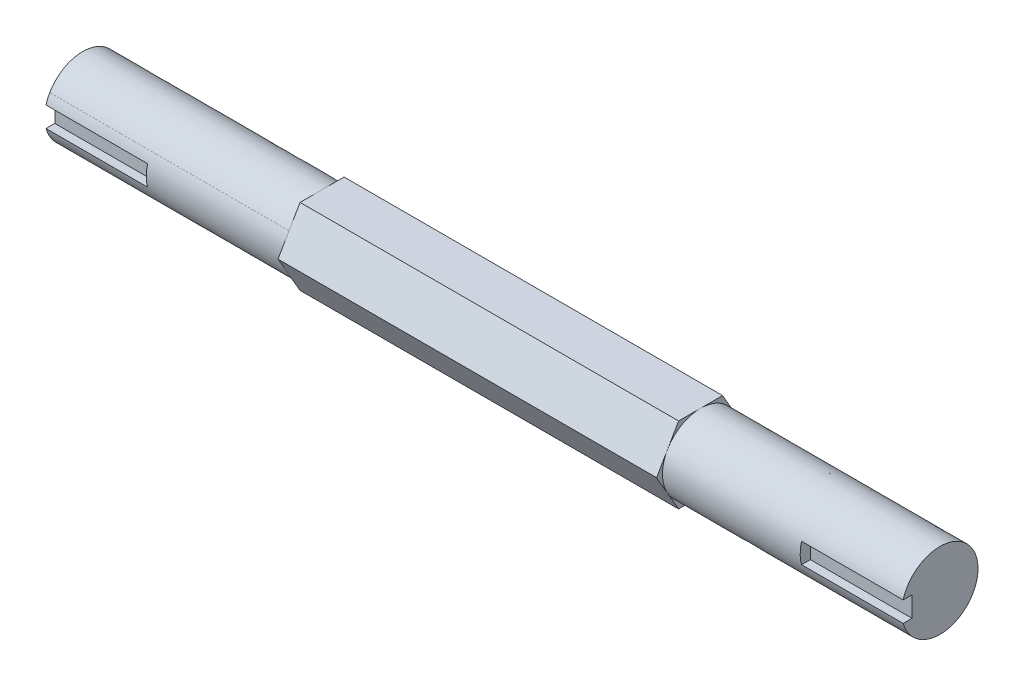
ISO-10303-21;
HEADER;
FILE_DESCRIPTION(('STEP AP214'),'2;1');
FILE_NAME('part.step','',(''),(''),'','','');
FILE_SCHEMA(('AUTOMOTIVE_DESIGN { 1 0 10303 214 1 1 1 1 }'));
ENDSEC;
DATA;
#1=APPLICATION_CONTEXT('core data for automotive mechanical design processes');
#2=APPLICATION_PROTOCOL_DEFINITION('international standard','automotive_design',2000,#1);
#3=PRODUCT_CONTEXT('',#1,'mechanical');
#4=PRODUCT('Part','Part','',(#3));
#5=PRODUCT_RELATED_PRODUCT_CATEGORY('part','',(#4));
#6=PRODUCT_DEFINITION_FORMATION('','',#4);
#7=PRODUCT_DEFINITION_CONTEXT('part definition',#1,'design');
#8=PRODUCT_DEFINITION('design','',#6,#7);
#9=PRODUCT_DEFINITION_SHAPE('','',#8);
#10=(LENGTH_UNIT() NAMED_UNIT(*) SI_UNIT(.MILLI.,.METRE.));
#11=(NAMED_UNIT(*) PLANE_ANGLE_UNIT() SI_UNIT($,.RADIAN.));
#12=(NAMED_UNIT(*) SI_UNIT($,.STERADIAN.) SOLID_ANGLE_UNIT());
#13=UNCERTAINTY_MEASURE_WITH_UNIT(LENGTH_MEASURE(1.E-05),#10,'distance_accuracy_value','');
#14=(GEOMETRIC_REPRESENTATION_CONTEXT(3) GLOBAL_UNCERTAINTY_ASSIGNED_CONTEXT((#13)) GLOBAL_UNIT_ASSIGNED_CONTEXT((#10,
#11,#12)) REPRESENTATION_CONTEXT('',''));
#15=CARTESIAN_POINT('',(0.,0.,0.));
#16=DIRECTION('',(0.,0.,1.));
#17=DIRECTION('',(1.,0.,0.));
#18=AXIS2_PLACEMENT_3D('',#15,#16,#17);
#19=CARTESIAN_POINT('',(-310.500108412167,140.898907372962,178.485208614066));
#20=CARTESIAN_POINT('',(-310.500108412167,140.898907372962,141.51479138593));
#21=CARTESIAN_POINT('',(-310.50010841216,108.878907372962,178.485208614066));
#22=CARTESIAN_POINT('',(-310.50010841216,108.878907372962,141.51479138593));
#23=(BOUNDED_SURFACE() B_SPLINE_SURFACE(1,1,((#19,#20),(#21,#22)),.UNSPECIFIED.,.F.,.F.,
.F.) B_SPLINE_SURFACE_WITH_KNOTS((2,2),(2,2),(-1.601,1.601),(-1.84852086140681,
1.84852086140681),.UNSPECIFIED.) GEOMETRIC_REPRESENTATION_ITEM() RATIONAL_B_SPLINE_SURFACE(((1.,
1.),(1.,1.))) REPRESENTATION_ITEM('') SURFACE());
#24=DIRECTION('',(0.,0.,1.));
#25=VECTOR('',#24,1.);
#26=CARTESIAN_POINT('',(-310.500108412167,139.8888999224,151.339736276399));
#27=LINE('',#26,#25);
#28=CARTESIAN_POINT('',(-310.500108412167,139.8888999224,159.999990314243));
#29=VERTEX_POINT('',#28);
#30=CARTESIAN_POINT('',(-310.500108412167,139.8888999224,168.660244352088));
#31=VERTEX_POINT('',#30);
#32=EDGE_CURVE('E205',#29,#31,#27,.T.);
#33=DIRECTION('',(0.,-0.866025403784439,0.499999999999999));
#34=VECTOR('',#33,1.);
#35=CARTESIAN_POINT('',(-310.500108412167,139.8888999224,168.660244352088));
#36=LINE('',#35,#34);
#37=CARTESIAN_POINT('',(-310.500108412167,132.388899922386,172.990371371018));
#38=VERTEX_POINT('',#37);
#39=EDGE_CURVE('E223',#31,#38,#36,.T.);
#40=CARTESIAN_POINT('',(-310.500108412167,139.888899922381,159.999990314243));
#41=CARTESIAN_POINT('',(-310.500108412166,139.888899922381,144.999990314242));
#42=CARTESIAN_POINT('',(-310.500108412164,124.888899922381,144.999990314243));
#43=CARTESIAN_POINT('',(-310.50010841216,109.888899922381,144.999990314242));
#44=CARTESIAN_POINT('',(-310.50010841216,109.888899922381,159.999990314243));
#45=CARTESIAN_POINT('',(-310.500108412161,109.888899922381,174.999990314243));
#46=CARTESIAN_POINT('',(-310.500108412164,124.888899922381,174.999990314243));
#47=CARTESIAN_POINT('',(-310.500108412167,139.888899922381,174.999990314243));
#48=CARTESIAN_POINT('',(-310.500108412167,139.888899922381,159.999990314243));
#49=(BOUNDED_CURVE() B_SPLINE_CURVE(2,(#40,#41,#42,#43,#44,#45,#46,#47,#48),.UNSPECIFIED.,.T.,
.F.) B_SPLINE_CURVE_WITH_KNOTS((3,2,2,2,3),(-3.14159265358979,-1.5707963267949,0.,
1.5707963267949,3.14159265358979),
.UNSPECIFIED.) CURVE() GEOMETRIC_REPRESENTATION_ITEM() RATIONAL_B_SPLINE_CURVE((1.,
0.707106781186539,1.,0.707106781186539,1.,0.707106781186553,1.,0.707106781186553,1.)) REPRESENTATION_ITEM(''));
#50=EDGE_CURVE('E307',#38,#29,#49,.T.);
#51=ORIENTED_EDGE('',*,*,#32,.T.);
#52=ORIENTED_EDGE('',*,*,#39,.T.);
#53=ORIENTED_EDGE('',*,*,#50,.T.);
#54=EDGE_LOOP('',(#51,#52,#53));
#55=FACE_BOUND('',#54,.T.);
#56=ADVANCED_FACE('F39',(#55),#23,.T.);
#57=CARTESIAN_POINT('',(-310.500108412167,117.388899922386,172.990371371002));
#58=VERTEX_POINT('',#57);
#59=EDGE_CURVE('E289',#58,#38,#49,.T.);
#60=CARTESIAN_POINT('',(-310.500108412167,124.8888999224,177.320498389932));
#61=VERTEX_POINT('',#60);
#62=EDGE_CURVE('E209',#38,#61,#36,.T.);
#63=DIRECTION('',(0.,-0.866025403784439,-0.499999999999999));
#64=VECTOR('',#63,1.);
#65=CARTESIAN_POINT('',(-310.500108412167,124.8888999224,177.320498389932));
#66=LINE('',#65,#64);
#67=EDGE_CURVE('E631',#61,#58,#66,.T.);
#68=ORIENTED_EDGE('',*,*,#59,.T.);
#69=ORIENTED_EDGE('',*,*,#62,.T.);
#70=ORIENTED_EDGE('',*,*,#67,.T.);
#71=EDGE_LOOP('',(#68,#69,#70));
#72=FACE_BOUND('',#71,.T.);
#73=ADVANCED_FACE('F578',(#72),#23,.T.);
#74=CARTESIAN_POINT('',(-310.500108412167,109.8888999224,159.999990314243));
#75=VERTEX_POINT('',#74);
#76=EDGE_CURVE('E612',#75,#58,#49,.T.);
#77=CARTESIAN_POINT('',(-310.500108412167,109.8888999224,168.660244352088));
#78=VERTEX_POINT('',#77);
#79=EDGE_CURVE('E792',#58,#78,#66,.T.);
#80=DIRECTION('',(0.,0.,-1.));
#81=VECTOR('',#80,1.);
#82=CARTESIAN_POINT('',(-310.500108412167,109.8888999224,168.660244352088));
#83=LINE('',#82,#81);
#84=EDGE_CURVE('E217',#78,#75,#83,.T.);
#85=ORIENTED_EDGE('',*,*,#76,.T.);
#86=ORIENTED_EDGE('',*,*,#79,.T.);
#87=ORIENTED_EDGE('',*,*,#84,.T.);
#88=EDGE_LOOP('',(#85,#86,#87));
#89=FACE_BOUND('',#88,.T.);
#90=ADVANCED_FACE('F585',(#89),#23,.T.);
#91=DIRECTION('',(0.,0.866025403784439,0.499999999999999));
#92=VECTOR('',#91,1.);
#93=CARTESIAN_POINT('',(-310.500108412167,124.8888999224,142.679482238555));
#94=LINE('',#93,#92);
#95=CARTESIAN_POINT('',(-310.500108412167,132.388899922386,147.009609257469));
#96=VERTEX_POINT('',#95);
#97=CARTESIAN_POINT('',(-310.500108412167,139.8888999224,151.339736276399));
#98=VERTEX_POINT('',#97);
#99=EDGE_CURVE('E193',#96,#98,#94,.T.);
#100=EDGE_CURVE('E202',#98,#29,#27,.T.);
#101=EDGE_CURVE('E213',#29,#96,#49,.T.);
#102=ORIENTED_EDGE('',*,*,#99,.T.);
#103=ORIENTED_EDGE('',*,*,#100,.T.);
#104=ORIENTED_EDGE('',*,*,#101,.T.);
#105=EDGE_LOOP('',(#102,#103,#104));
#106=FACE_BOUND('',#105,.T.);
#107=ADVANCED_FACE('F211',(#106),#23,.T.);
#108=CARTESIAN_POINT('',(-310.500108412167,117.388899922386,147.009609257485));
#109=VERTEX_POINT('',#108);
#110=EDGE_CURVE('E606',#109,#75,#49,.T.);
#111=CARTESIAN_POINT('',(-310.500108412167,109.8888999224,151.339736276399));
#112=VERTEX_POINT('',#111);
#113=EDGE_CURVE('E607',#75,#112,#83,.T.);
#114=DIRECTION('',(0.,0.866025403784439,-0.5));
#115=VECTOR('',#114,1.);
#116=CARTESIAN_POINT('',(-310.500108412167,109.8888999224,151.339736276399));
#117=LINE('',#116,#115);
#118=EDGE_CURVE('E214',#112,#109,#117,.T.);
#119=ORIENTED_EDGE('',*,*,#110,.T.);
#120=ORIENTED_EDGE('',*,*,#113,.T.);
#121=ORIENTED_EDGE('',*,*,#118,.T.);
#122=EDGE_LOOP('',(#119,#120,#121));
#123=FACE_BOUND('',#122,.T.);
#124=ADVANCED_FACE('F592',(#123),#23,.T.);
#125=DIRECTION('',(-1.74159643676213E-13,0.866025403784439,-0.5));
#126=VECTOR('',#125,1.);
#127=CARTESIAN_POINT('',(-310.500108412162,117.388901316267,147.009608452727));
#128=LINE('',#127,#126);
#129=CARTESIAN_POINT('',(-310.500108412163,124.8888999224,142.679482238555));
#130=VERTEX_POINT('',#129);
#131=EDGE_CURVE('E12',#109,#130,#128,.T.);
#132=EDGE_CURVE('E60',#130,#96,#94,.T.);
#133=EDGE_CURVE('E313',#96,#109,#49,.T.);
#134=ORIENTED_EDGE('',*,*,#131,.T.);
#135=ORIENTED_EDGE('',*,*,#132,.T.);
#136=ORIENTED_EDGE('',*,*,#133,.T.);
#137=EDGE_LOOP('',(#134,#135,#136));
#138=FACE_BOUND('',#137,.T.);
#139=ADVANCED_FACE('F581',(#138),#23,.T.);
#140=CARTESIAN_POINT('',(-216.290108412163,120.8888999224,174.466822609044));
#141=CARTESIAN_POINT('',(-256.310108412163,120.888899922392,174.466822609044));
#142=CARTESIAN_POINT('',(-216.290108412163,120.8888999224,170.989990314243));
#143=CARTESIAN_POINT('',(-256.310108412163,120.888899922392,170.989990314243));
#144=(BOUNDED_SURFACE() B_SPLINE_SURFACE(1,1,((#140,#141),(#142,#143)),.UNSPECIFIED.,.F.,.F.,
.F.) B_SPLINE_SURFACE_WITH_KNOTS((2,2),(2,2),(-0.001,0.346683229480102),(-0.00100000000000711,
4.001),.UNSPECIFIED.) GEOMETRIC_REPRESENTATION_ITEM() RATIONAL_B_SPLINE_SURFACE(((1.,1.),(1.,1.))) REPRESENTATION_ITEM('') SURFACE());
#145=CARTESIAN_POINT('',(-216.300108412163,120.8888999224,170.999990314243));
#146=CARTESIAN_POINT('',(-216.300108412163,120.8888999224,174.456822609044));
#147=(BOUNDED_CURVE() B_SPLINE_CURVE(1,(#145,#146),.UNSPECIFIED.,.F.,
.F.) B_SPLINE_CURVE_WITH_KNOTS((2,2),(0.55,0.895683229480099),
.UNSPECIFIED.) CURVE() GEOMETRIC_REPRESENTATION_ITEM() RATIONAL_B_SPLINE_CURVE((1.,1.)) REPRESENTATION_ITEM(''));
#148=CARTESIAN_POINT('',(-216.300108412163,120.8888999224,170.999990314243));
#149=VERTEX_POINT('',#148);
#150=CARTESIAN_POINT('',(-216.300108412163,120.8888999224,174.456822609044));
#151=VERTEX_POINT('',#150);
#152=EDGE_CURVE('E317',#149,#151,#147,.T.);
#153=CARTESIAN_POINT('',(-216.300108412163,120.8888999224,170.999990314243));
#154=CARTESIAN_POINT('',(-256.300108412163,120.888899922392,170.999990314243));
#155=(BOUNDED_CURVE() B_SPLINE_CURVE(1,(#153,#154),.UNSPECIFIED.,.F.,
.F.) B_SPLINE_CURVE_WITH_KNOTS((2,2),(0.,4.),
.UNSPECIFIED.) CURVE() GEOMETRIC_REPRESENTATION_ITEM() RATIONAL_B_SPLINE_CURVE((1.,1.)) REPRESENTATION_ITEM(''));
#156=CARTESIAN_POINT('',(-256.300108412163,120.888899922392,170.999990314243));
#157=VERTEX_POINT('',#156);
#158=EDGE_CURVE('E361',#149,#157,#155,.T.);
#159=CARTESIAN_POINT('',(-256.300108412163,120.888899922392,170.999990314243));
#160=CARTESIAN_POINT('',(-256.300108412163,120.888899922392,174.456822609044));
#161=(BOUNDED_CURVE() B_SPLINE_CURVE(1,(#159,#160),.UNSPECIFIED.,.F.,
.F.) B_SPLINE_CURVE_WITH_KNOTS((2,2),(1.1,1.4456832294801),
.UNSPECIFIED.) CURVE() GEOMETRIC_REPRESENTATION_ITEM() RATIONAL_B_SPLINE_CURVE((1.,1.)) REPRESENTATION_ITEM(''));
#162=CARTESIAN_POINT('',(-256.300108412163,120.888899922392,174.456822609044));
#163=VERTEX_POINT('',#162);
#164=EDGE_CURVE('E353',#157,#163,#161,.T.);
#165=CARTESIAN_POINT('',(-216.300108412163,120.8888999224,174.456822609044));
#166=CARTESIAN_POINT('',(-256.300108412163,120.888899922392,174.456822609044));
#167=(BOUNDED_CURVE() B_SPLINE_CURVE(1,(#165,#166),.UNSPECIFIED.,.F.,
.F.) B_SPLINE_CURVE_WITH_KNOTS((2,2),(-9.42,-5.42),
.UNSPECIFIED.) CURVE() GEOMETRIC_REPRESENTATION_ITEM() RATIONAL_B_SPLINE_CURVE((1.,1.)) REPRESENTATION_ITEM(''));
#168=EDGE_CURVE('E507',#151,#163,#167,.T.);
#169=ORIENTED_EDGE('',*,*,#152,.F.);
#170=ORIENTED_EDGE('',*,*,#158,.T.);
#171=ORIENTED_EDGE('',*,*,#164,.T.);
#172=ORIENTED_EDGE('',*,*,#168,.F.);
#173=EDGE_LOOP('',(#169,#170,#171,#172));
#174=FACE_BOUND('',#173,.T.);
#175=ADVANCED_FACE('F496',(#174),#144,.T.);
#176=CARTESIAN_POINT('',(-216.290108412163,120.8788999224,170.999990314243));
#177=CARTESIAN_POINT('',(-256.310108412163,120.878899922392,170.999990314243));
#178=CARTESIAN_POINT('',(-216.290108412164,128.8988999224,170.999990314243));
#179=CARTESIAN_POINT('',(-256.310108412164,128.898899922392,170.999990314243));
#180=(BOUNDED_SURFACE() B_SPLINE_SURFACE(1,1,((#176,#177),(#178,#179)),.UNSPECIFIED.,.F.,.F.,
.F.) B_SPLINE_SURFACE_WITH_KNOTS((2,2),(2,2),(-0.001,0.801),(-0.00100000000000711,4.001),
.UNSPECIFIED.) GEOMETRIC_REPRESENTATION_ITEM() RATIONAL_B_SPLINE_SURFACE(((1.,1.),(1.,1.))) REPRESENTATION_ITEM('') SURFACE());
#181=CARTESIAN_POINT('',(-216.300108412164,128.8888999224,170.999990314243));
#182=CARTESIAN_POINT('',(-216.300108412163,120.8888999224,170.999990314243));
#183=(BOUNDED_CURVE() B_SPLINE_CURVE(1,(#181,#182),.UNSPECIFIED.,.F.,
.F.) B_SPLINE_CURVE_WITH_KNOTS((2,2),(-0.200000000000003,0.6),
.UNSPECIFIED.) CURVE() GEOMETRIC_REPRESENTATION_ITEM() RATIONAL_B_SPLINE_CURVE((1.,1.)) REPRESENTATION_ITEM(''));
#184=CARTESIAN_POINT('',(-216.300108412164,128.8888999224,170.999990314243));
#185=VERTEX_POINT('',#184);
#186=EDGE_CURVE('E306',#185,#149,#183,.T.);
#187=CARTESIAN_POINT('',(-216.300108412164,128.8888999224,170.999990314243));
#188=CARTESIAN_POINT('',(-256.300108412164,128.888899922392,170.999990314243));
#189=(BOUNDED_CURVE() B_SPLINE_CURVE(1,(#187,#188),.UNSPECIFIED.,.F.,
.F.) B_SPLINE_CURVE_WITH_KNOTS((2,2),(0.,4.),
.UNSPECIFIED.) CURVE() GEOMETRIC_REPRESENTATION_ITEM() RATIONAL_B_SPLINE_CURVE((1.,1.)) REPRESENTATION_ITEM(''));
#190=CARTESIAN_POINT('',(-256.300108412164,128.888899922392,170.999990314243));
#191=VERTEX_POINT('',#190);
#192=EDGE_CURVE('E362',#185,#191,#189,.T.);
#193=CARTESIAN_POINT('',(-256.300108412164,128.888899922392,170.999990314243));
#194=CARTESIAN_POINT('',(-256.300108412163,120.888899922393,170.999990314243));
#195=(BOUNDED_CURVE() B_SPLINE_CURVE(1,(#193,#194),.UNSPECIFIED.,.F.,
.F.) B_SPLINE_CURVE_WITH_KNOTS((2,2),(0.,0.8),
.UNSPECIFIED.) CURVE() GEOMETRIC_REPRESENTATION_ITEM() RATIONAL_B_SPLINE_CURVE((1.,1.)) REPRESENTATION_ITEM(''));
#196=EDGE_CURVE('E435',#191,#157,#195,.T.);
#197=ORIENTED_EDGE('',*,*,#186,.F.);
#198=ORIENTED_EDGE('',*,*,#192,.T.);
#199=ORIENTED_EDGE('',*,*,#196,.T.);
#200=ORIENTED_EDGE('',*,*,#158,.F.);
#201=EDGE_LOOP('',(#197,#198,#199,#200));
#202=FACE_BOUND('',#201,.T.);
#203=ADVANCED_FACE('F499',(#202),#180,.T.);
#204=CARTESIAN_POINT('',(-216.290108412164,128.8888999224,170.989990314243));
#205=CARTESIAN_POINT('',(-256.310108412164,128.888899922392,170.989990314243));
#206=CARTESIAN_POINT('',(-216.290108412164,128.8888999224,174.466822609044));
#207=CARTESIAN_POINT('',(-256.310108412164,128.888899922392,174.466822609044));
#208=(BOUNDED_SURFACE() B_SPLINE_SURFACE(1,1,((#204,#205),(#206,#207)),.UNSPECIFIED.,.F.,.F.,
.F.) B_SPLINE_SURFACE_WITH_KNOTS((2,2),(2,2),(-0.001,0.346683229480102),(-0.00100000000000711,
4.001),.UNSPECIFIED.) GEOMETRIC_REPRESENTATION_ITEM() RATIONAL_B_SPLINE_SURFACE(((1.,1.),(1.,1.))) REPRESENTATION_ITEM('') SURFACE());
#209=CARTESIAN_POINT('',(-216.300108412164,128.8888999224,174.456822609044));
#210=CARTESIAN_POINT('',(-216.300108412164,128.8888999224,170.999990314243));
#211=(BOUNDED_CURVE() B_SPLINE_CURVE(1,(#209,#210),.UNSPECIFIED.,.F.,
.F.) B_SPLINE_CURVE_WITH_KNOTS((2,2),(-0.722841614740048,-0.377158385259946),
.UNSPECIFIED.) CURVE() GEOMETRIC_REPRESENTATION_ITEM() RATIONAL_B_SPLINE_CURVE((1.,1.)) REPRESENTATION_ITEM(''));
#212=CARTESIAN_POINT('',(-216.300108412164,128.8888999224,174.456822609044));
#213=VERTEX_POINT('',#212);
#214=EDGE_CURVE('E434',#213,#185,#211,.T.);
#215=CARTESIAN_POINT('',(-256.300108412164,128.888899922392,174.456822609044));
#216=CARTESIAN_POINT('',(-216.300108412164,128.8888999224,174.456822609044));
#217=(BOUNDED_CURVE() B_SPLINE_CURVE(1,(#215,#216),.UNSPECIFIED.,.F.,
.F.) B_SPLINE_CURVE_WITH_KNOTS((2,2),(5.42,9.42),
.UNSPECIFIED.) CURVE() GEOMETRIC_REPRESENTATION_ITEM() RATIONAL_B_SPLINE_CURVE((1.,1.)) REPRESENTATION_ITEM(''));
#218=CARTESIAN_POINT('',(-256.300108412164,128.888899922392,174.456822609044));
#219=VERTEX_POINT('',#218);
#220=EDGE_CURVE('E294',#219,#213,#217,.T.);
#221=CARTESIAN_POINT('',(-256.300108412164,128.888899922392,174.456822609044));
#222=CARTESIAN_POINT('',(-256.300108412164,128.888899922392,170.999990314243));
#223=(BOUNDED_CURVE() B_SPLINE_CURVE(1,(#221,#222),.UNSPECIFIED.,.F.,
.F.) B_SPLINE_CURVE_WITH_KNOTS((2,2),(-1.4456832294801,-1.1),
.UNSPECIFIED.) CURVE() GEOMETRIC_REPRESENTATION_ITEM() RATIONAL_B_SPLINE_CURVE((1.,1.)) REPRESENTATION_ITEM(''));
#224=EDGE_CURVE('E443',#219,#191,#223,.T.);
#225=ORIENTED_EDGE('',*,*,#214,.F.);
#226=ORIENTED_EDGE('',*,*,#220,.F.);
#227=ORIENTED_EDGE('',*,*,#224,.T.);
#228=ORIENTED_EDGE('',*,*,#192,.F.);
#229=EDGE_LOOP('',(#225,#226,#227,#228));
#230=FACE_BOUND('',#229,.T.);
#231=ADVANCED_FACE('F637',(#230),#208,.T.);
#232=CARTESIAN_POINT('',(-256.300108412163,120.878899922392,170.989990314243));
#233=CARTESIAN_POINT('',(-256.300108412163,120.878899922392,175.57356575123));
#234=CARTESIAN_POINT('',(-256.300108412164,128.898899922392,170.989990314243));
#235=CARTESIAN_POINT('',(-256.300108412164,128.898899922392,175.57356575123));
#236=(BOUNDED_SURFACE() B_SPLINE_SURFACE(1,1,((#232,#233),(#234,#235)),.UNSPECIFIED.,.F.,.F.,
.F.) B_SPLINE_SURFACE_WITH_KNOTS((2,2),(2,2),(-0.401,0.401000000000006),(-0.201000000000003,
0.25735754369867),.UNSPECIFIED.) GEOMETRIC_REPRESENTATION_ITEM() RATIONAL_B_SPLINE_SURFACE(((1.,
1.),(1.,1.))) REPRESENTATION_ITEM('') SURFACE());
#237=CARTESIAN_POINT('',(-256.300108412163,120.888899922392,174.456822609044));
#238=CARTESIAN_POINT('',(-256.300108412164,124.888899922392,175.56356575123));
#239=CARTESIAN_POINT('',(-256.300108412164,128.888899922392,174.456822609044));
#240=(BOUNDED_CURVE() B_SPLINE_CURVE(2,(#237,#238,#239),.UNSPECIFIED.,.F.,
.F.) B_SPLINE_CURVE_WITH_KNOTS((3,3),(1.30086353096149,1.8407291226283),
.UNSPECIFIED.) CURVE() GEOMETRIC_REPRESENTATION_ITEM() RATIONAL_B_SPLINE_CURVE((1.,
0.963788819653417,1.)) REPRESENTATION_ITEM(''));
#241=EDGE_CURVE('E333',#163,#219,#240,.T.);
#242=ORIENTED_EDGE('',*,*,#241,.F.);
#243=ORIENTED_EDGE('',*,*,#164,.F.);
#244=ORIENTED_EDGE('',*,*,#196,.F.);
#245=ORIENTED_EDGE('',*,*,#224,.F.);
#246=EDGE_LOOP('',(#242,#243,#244,#245));
#247=FACE_BOUND('',#246,.T.);
#248=ADVANCED_FACE('F504',(#247),#236,.T.);
#249=CARTESIAN_POINT('',(-216.300108412167,139.8888999224,159.999990314243));
#250=CARTESIAN_POINT('',(-216.300108412166,139.8888999224,174.999990314243));
#251=CARTESIAN_POINT('',(-216.300108412164,124.8888999224,174.999990314243));
#252=CARTESIAN_POINT('',(-216.30010841216,109.8888999224,174.999990314243));
#253=CARTESIAN_POINT('',(-216.300108412161,109.8888999224,159.999990314243));
#254=CARTESIAN_POINT('',(-216.30010841216,109.8888999224,144.999990314242));
#255=CARTESIAN_POINT('',(-216.300108412164,124.8888999224,144.999990314243));
#256=CARTESIAN_POINT('',(-216.300108412166,139.8888999224,144.999990314242));
#257=CARTESIAN_POINT('',(-216.300108412167,139.8888999224,159.999990314243));
#258=CARTESIAN_POINT('',(-310.500108412167,139.888899922381,159.999990314243));
#259=CARTESIAN_POINT('',(-310.500108412166,139.888899922381,174.999990314243));
#260=CARTESIAN_POINT('',(-310.500108412164,124.888899922381,174.999990314243));
#261=CARTESIAN_POINT('',(-310.50010841216,109.888899922381,174.999990314243));
#262=CARTESIAN_POINT('',(-310.50010841216,109.888899922381,159.999990314243));
#263=CARTESIAN_POINT('',(-310.50010841216,109.888899922381,144.999990314242));
#264=CARTESIAN_POINT('',(-310.500108412164,124.888899922381,144.999990314243));
#265=CARTESIAN_POINT('',(-310.500108412166,139.888899922381,144.999990314242));
#266=CARTESIAN_POINT('',(-310.500108412167,139.888899922381,159.999990314243));
#267=(BOUNDED_SURFACE() B_SPLINE_SURFACE(1,2,((#249,#250,#251,#252,#253,#254,#255,#256,#257),
(#258,#259,#260,#261,#262,#263,#264,#265,#266)),.UNSPECIFIED.,.F.,.T.,
.F.) B_SPLINE_SURFACE_WITH_KNOTS((2,2),(3,2,2,2,3),(0.,6.28),(-3.14159265358979,
-1.5707963267949,0.,1.5707963267949,3.14159265358979),
.UNSPECIFIED.) GEOMETRIC_REPRESENTATION_ITEM() RATIONAL_B_SPLINE_SURFACE(((1.,0.707106781186548,
1.,0.707106781186548,1.,0.707106781186548,1.,0.707106781186548,1.),(1.,0.707106781186548,1.,
0.707106781186548,1.,0.707106781186548,1.,0.707106781186548,1.))) REPRESENTATION_ITEM('') SURFACE());
#268=CARTESIAN_POINT('',(-216.300108412167,139.8888999224,159.999990314243));
#269=CARTESIAN_POINT('',(-216.300108412167,139.8888999224,171.413278968033));
#270=CARTESIAN_POINT('',(-216.300108412164,128.8888999224,174.456822609044));
#271=(BOUNDED_CURVE() B_SPLINE_CURVE(2,(#268,#269,#270),.UNSPECIFIED.,.F.,
.F.) B_SPLINE_CURVE_WITH_KNOTS((3,3),(-3.14159265358979,-1.8407291226283),
.UNSPECIFIED.) CURVE() GEOMETRIC_REPRESENTATION_ITEM() RATIONAL_B_SPLINE_CURVE((1.,
0.795822425754228,1.)) REPRESENTATION_ITEM(''));
#272=CARTESIAN_POINT('',(-216.300108412167,139.8888999224,159.999990314243));
#273=VERTEX_POINT('',#272);
#274=EDGE_CURVE('E346',#273,#213,#271,.T.);
#275=CARTESIAN_POINT('',(-216.300108412167,139.8888999224,159.999990314243));
#276=CARTESIAN_POINT('',(-310.500108412167,139.888899922381,159.999990314243));
#277=(BOUNDED_CURVE() B_SPLINE_CURVE(1,(#275,#276),.UNSPECIFIED.,.F.,
.F.) B_SPLINE_CURVE_WITH_KNOTS((2,2),(-6.28,0.),
.UNSPECIFIED.) CURVE() GEOMETRIC_REPRESENTATION_ITEM() RATIONAL_B_SPLINE_CURVE((1.,1.)) REPRESENTATION_ITEM(''));
#278=EDGE_CURVE('E314',#273,#29,#277,.T.);
#279=CARTESIAN_POINT('',(-216.300108412163,120.8888999224,174.456822609044));
#280=CARTESIAN_POINT('',(-216.30010841216,107.677661384184,170.801460696056));
#281=CARTESIAN_POINT('',(-216.300108412161,110.131124230057,157.315207899505));
#282=CARTESIAN_POINT('',(-216.300108412161,112.58458707593,143.828955102954));
#283=CARTESIAN_POINT('',(-216.300108412164,126.236743499165,145.060669121747));
#284=CARTESIAN_POINT('',(-216.300108412166,139.8888999224,146.29238314054));
#285=CARTESIAN_POINT('',(-216.300108412167,139.8888999224,159.999990314243));
#286=(BOUNDED_CURVE() B_SPLINE_CURVE(2,(#279,#280,#281,#282,#283,#284,#285),.UNSPECIFIED.,.F.,
.F.) B_SPLINE_CURVE_WITH_KNOTS((3,2,2,3),(-7.58404883814108,-6.10323010995732,-4.62241138177356,
-3.14159265358979),
.UNSPECIFIED.) CURVE() GEOMETRIC_REPRESENTATION_ITEM() RATIONAL_B_SPLINE_CURVE((1.,
0.738192467602814,1.,0.738192467602777,1.,0.738192467602777,1.)) REPRESENTATION_ITEM(''));
#287=EDGE_CURVE('E335',#151,#273,#286,.T.);
#288=ORIENTED_EDGE('',*,*,#168,.T.);
#289=ORIENTED_EDGE('',*,*,#241,.T.);
#290=ORIENTED_EDGE('',*,*,#220,.T.);
#291=ORIENTED_EDGE('',*,*,#274,.F.);
#292=ORIENTED_EDGE('',*,*,#278,.T.);
#293=ORIENTED_EDGE('',*,*,#50,.F.);
#294=ORIENTED_EDGE('',*,*,#59,.F.);
#295=ORIENTED_EDGE('',*,*,#76,.F.);
#296=ORIENTED_EDGE('',*,*,#110,.F.);
#297=ORIENTED_EDGE('',*,*,#133,.F.);
#298=ORIENTED_EDGE('',*,*,#101,.F.);
#299=ORIENTED_EDGE('',*,*,#278,.F.);
#300=ORIENTED_EDGE('',*,*,#287,.F.);
#301=EDGE_LOOP('',(#288,#289,#290,#291,#292,#293,#294,#295,#296,#297,#298,#299,#300));
#302=FACE_BOUND('',#301,.T.);
#303=ADVANCED_FACE('F609',(#302),#267,.T.);
#304=CARTESIAN_POINT('',(-216.300108412167,139.8988999224,174.466822609044));
#305=CARTESIAN_POINT('',(-216.300108412167,139.8988999224,143.818955102954));
#306=CARTESIAN_POINT('',(-216.30010841216,107.667661384184,174.466822609044));
#307=CARTESIAN_POINT('',(-216.30010841216,107.667661384184,143.818955102954));
#308=(BOUNDED_SURFACE() B_SPLINE_SURFACE(1,1,((#304,#305),(#306,#307)),.UNSPECIFIED.,.F.,.F.,
.F.) B_SPLINE_SURFACE_WITH_KNOTS((2,2),(2,2),(-1.501,1.72212385382162),(-1.4466832294801,
1.61810352112894),.UNSPECIFIED.) GEOMETRIC_REPRESENTATION_ITEM() RATIONAL_B_SPLINE_SURFACE(((1.,
1.),(1.,1.))) REPRESENTATION_ITEM('') SURFACE());
#309=ORIENTED_EDGE('',*,*,#152,.T.);
#310=ORIENTED_EDGE('',*,*,#287,.T.);
#311=ORIENTED_EDGE('',*,*,#274,.T.);
#312=ORIENTED_EDGE('',*,*,#214,.T.);
#313=ORIENTED_EDGE('',*,*,#186,.T.);
#314=EDGE_LOOP('',(#309,#310,#311,#312,#313));
#315=FACE_BOUND('',#314,.T.);
#316=ADVANCED_FACE('F41',(#315),#308,.T.);
#317=CARTESIAN_POINT('',(-553.700108412167,139.8888999224,168.660244352088));
#318=DIRECTION('',(0.,0.499999999999999,0.866025403784439));
#319=DIRECTION('',(0.,-0.866025403784439,0.5));
#320=AXIS2_PLACEMENT_3D('',#317,#318,#319);
#321=PLANE('',#320);
#322=DIRECTION('',(-1.74159643676213E-13,0.866025403784439,-0.5));
#323=VECTOR('',#322,1.);
#324=CARTESIAN_POINT('',(-459.500108412165,132.388901316244,172.990370566274));
#325=LINE('',#324,#323);
#326=CARTESIAN_POINT('',(-459.500108412165,132.405410426844,172.98083902683));
#327=VERTEX_POINT('',#326);
#328=CARTESIAN_POINT('',(-459.500108412166,139.8888999224,168.660244352088));
#329=VERTEX_POINT('',#328);
#330=EDGE_CURVE('E240',#327,#329,#325,.T.);
#331=ORIENTED_EDGE('',*,*,#330,.F.);
#332=DIRECTION('',(-1.,-1.99840144432533E-13,0.));
#333=VECTOR('',#332,1.);
#334=CARTESIAN_POINT('',(-506.600108412165,132.405410426834,172.98083902683));
#335=LINE('',#334,#333);
#336=CARTESIAN_POINT('',(-553.700108412167,132.405410425281,172.980839027726));
#337=VERTEX_POINT('',#336);
#338=EDGE_CURVE('E51',#337,#327,#335,.F.);
#339=ORIENTED_EDGE('',*,*,#338,.F.);
#340=DIRECTION('',(0.,-0.866025403784439,0.5));
#341=VECTOR('',#340,1.);
#342=CARTESIAN_POINT('',(-553.700108412167,139.8888999224,168.660244352088));
#343=LINE('',#342,#341);
#344=CARTESIAN_POINT('',(-553.700108412166,132.372392205618,172.999902105735));
#345=VERTEX_POINT('',#344);
#346=EDGE_CURVE('E45',#345,#337,#343,.F.);
#347=ORIENTED_EDGE('',*,*,#346,.F.);
#348=DIRECTION('',(-1.,-1.99840144432533E-13,0.));
#349=VECTOR('',#348,1.);
#350=CARTESIAN_POINT('',(-506.600108412165,132.372392205622,172.999902105735));
#351=LINE('',#350,#349);
#352=CARTESIAN_POINT('',(-459.500108412165,132.372392205632,172.999902105735));
#353=VERTEX_POINT('',#352);
#354=EDGE_CURVE('E259',#353,#345,#351,.T.);
#355=ORIENTED_EDGE('',*,*,#354,.F.);
#356=CARTESIAN_POINT('',(-459.500108412165,124.8888999224,177.320498389932));
#357=VERTEX_POINT('',#356);
#358=EDGE_CURVE('E235',#357,#353,#325,.T.);
#359=ORIENTED_EDGE('',*,*,#358,.F.);
#360=DIRECTION('',(1.,0.,0.));
#361=VECTOR('',#360,1.);
#362=CARTESIAN_POINT('',(-553.700108412167,124.8888999224,177.320498389932));
#363=LINE('',#362,#361);
#364=EDGE_CURVE('E778',#357,#61,#363,.T.);
#365=ORIENTED_EDGE('',*,*,#364,.T.);
#366=ORIENTED_EDGE('',*,*,#62,.F.);
#367=ORIENTED_EDGE('',*,*,#39,.F.);
#368=DIRECTION('',(1.,0.,0.));
#369=VECTOR('',#368,1.);
#370=CARTESIAN_POINT('',(-553.700108412167,139.8888999224,168.660244352088));
#371=LINE('',#370,#369);
#372=EDGE_CURVE('E198',#329,#31,#371,.T.);
#373=ORIENTED_EDGE('',*,*,#372,.F.);
#374=EDGE_LOOP('',(#331,#339,#347,#355,#359,#365,#366,#367,#373));
#375=FACE_BOUND('',#374,.T.);
#376=ADVANCED_FACE('F738',(#375),#321,.T.);
#377=CARTESIAN_POINT('',(-553.700108412167,109.8888999224,168.660244352088));
#378=DIRECTION('',(0.,-1.,0.));
#379=DIRECTION('',(0.,0.,-1.));
#380=AXIS2_PLACEMENT_3D('',#377,#378,#379);
#381=PLANE('',#380);
#382=DIRECTION('',(1.,0.,0.));
#383=VECTOR('',#382,1.);
#384=CARTESIAN_POINT('',(-553.700108412167,109.8888999224,151.339736276399));
#385=LINE('',#384,#383);
#386=CARTESIAN_POINT('',(-459.500108412162,109.8888999224,151.339736276399));
#387=VERTEX_POINT('',#386);
#388=EDGE_CURVE('E785',#387,#112,#385,.T.);
#389=ORIENTED_EDGE('',*,*,#388,.T.);
#390=ORIENTED_EDGE('',*,*,#113,.F.);
#391=ORIENTED_EDGE('',*,*,#84,.F.);
#392=DIRECTION('',(1.,0.,0.));
#393=VECTOR('',#392,1.);
#394=CARTESIAN_POINT('',(-553.700108412167,109.8888999224,168.660244352088));
#395=LINE('',#394,#393);
#396=CARTESIAN_POINT('',(-459.500108412162,109.8888999224,168.660244352088));
#397=VERTEX_POINT('',#396);
#398=EDGE_CURVE('E780',#397,#78,#395,.T.);
#399=ORIENTED_EDGE('',*,*,#398,.F.);
#400=DIRECTION('',(0.,0.,1.));
#401=VECTOR('',#400,1.);
#402=CARTESIAN_POINT('',(-459.500108412161,109.8888999224,159.999999999998));
#403=LINE('',#402,#401);
#404=CARTESIAN_POINT('',(-459.500108412161,109.888907372932,159.999999999998));
#405=VERTEX_POINT('',#404);
#406=EDGE_CURVE('E241',#405,#397,#403,.T.);
#407=ORIENTED_EDGE('',*,*,#406,.F.);
#408=EDGE_CURVE('E244',#387,#405,#403,.T.);
#409=ORIENTED_EDGE('',*,*,#408,.F.);
#410=EDGE_LOOP('',(#389,#390,#391,#399,#407,#409));
#411=FACE_BOUND('',#410,.T.);
#412=ADVANCED_FACE('F802',(#411),#381,.T.);
#413=CARTESIAN_POINT('',(-553.700108412167,124.8888999224,177.320498389932));
#414=DIRECTION('',(0.,-0.499999999999999,0.866025403784439));
#415=DIRECTION('',(0.,-0.866025403784439,-0.5));
#416=AXIS2_PLACEMENT_3D('',#413,#414,#415);
#417=PLANE('',#416);
#418=ORIENTED_EDGE('',*,*,#398,.T.);
#419=ORIENTED_EDGE('',*,*,#79,.F.);
#420=ORIENTED_EDGE('',*,*,#67,.F.);
#421=ORIENTED_EDGE('',*,*,#364,.F.);
#422=DIRECTION('',(-1.74159643676213E-13,0.866025403784439,0.5));
#423=VECTOR('',#422,1.);
#424=CARTESIAN_POINT('',(-459.500108412162,117.388909704354,172.990377018624));
#425=LINE('',#424,#423);
#426=CARTESIAN_POINT('',(-459.500108412162,117.388907372932,172.990381056765));
#427=VERTEX_POINT('',#426);
#428=EDGE_CURVE('E236',#427,#357,#425,.T.);
#429=ORIENTED_EDGE('',*,*,#428,.F.);
#430=EDGE_CURVE('E239',#397,#427,#425,.T.);
#431=ORIENTED_EDGE('',*,*,#430,.F.);
#432=EDGE_LOOP('',(#418,#419,#420,#421,#429,#431));
#433=FACE_BOUND('',#432,.T.);
#434=ADVANCED_FACE('F793',(#433),#417,.T.);
#435=CARTESIAN_POINT('',(-553.700108412167,139.8888999224,151.339736276399));
#436=DIRECTION('',(0.,1.,0.));
#437=DIRECTION('',(0.,0.,1.));
#438=AXIS2_PLACEMENT_3D('',#435,#436,#437);
#439=PLANE('',#438);
#440=DIRECTION('',(0.,0.,-1.));
#441=VECTOR('',#440,1.);
#442=CARTESIAN_POINT('',(-459.500108412166,139.8888999224,159.999999999998));
#443=LINE('',#442,#441);
#444=CARTESIAN_POINT('',(-459.500108412167,139.888899922411,160.014950437545));
#445=VERTEX_POINT('',#444);
#446=EDGE_CURVE('E231',#329,#445,#443,.T.);
#447=ORIENTED_EDGE('',*,*,#446,.F.);
#448=ORIENTED_EDGE('',*,*,#372,.T.);
#449=ORIENTED_EDGE('',*,*,#32,.F.);
#450=ORIENTED_EDGE('',*,*,#100,.F.);
#451=DIRECTION('',(1.,0.,0.));
#452=VECTOR('',#451,1.);
#453=CARTESIAN_POINT('',(-553.700108412167,139.8888999224,151.339736276399));
#454=LINE('',#453,#452);
#455=CARTESIAN_POINT('',(-459.500108412165,139.8888999224,151.339736276399));
#456=VERTEX_POINT('',#455);
#457=EDGE_CURVE('E189',#456,#98,#454,.T.);
#458=ORIENTED_EDGE('',*,*,#457,.F.);
#459=CARTESIAN_POINT('',(-459.500108412167,139.8888999224,159.999999999998));
#460=VERTEX_POINT('',#459);
#461=EDGE_CURVE('E229',#460,#456,#443,.T.);
#462=ORIENTED_EDGE('',*,*,#461,.F.);
#463=CARTESIAN_POINT('',(-459.500108412167,139.888907372932,159.999999999998));
#464=CARTESIAN_POINT('',(-459.500108412166,139.888907372932,174.999999999998));
#465=CARTESIAN_POINT('',(-459.500108412164,124.888907372932,174.999999999998));
#466=CARTESIAN_POINT('',(-459.50010841216,109.888907372932,174.999999999998));
#467=CARTESIAN_POINT('',(-459.500108412161,109.888907372932,159.999999999998));
#468=CARTESIAN_POINT('',(-459.500108412161,109.888907372932,144.999999999997));
#469=CARTESIAN_POINT('',(-459.500108412164,124.888907372932,144.999999999998));
#470=CARTESIAN_POINT('',(-459.500108412167,139.888907372932,144.999999999997));
#471=CARTESIAN_POINT('',(-459.500108412167,139.888907372932,159.999999999998));
#472=(BOUNDED_CURVE() B_SPLINE_CURVE(2,(#463,#464,#465,#466,#467,#468,#469,#470,#471),
.UNSPECIFIED.,.T.,.F.) B_SPLINE_CURVE_WITH_KNOTS((3,2,2,2,3),(-3.14159265358979,
-1.5707963267949,0.,1.5707963267949,3.14159265358979),
.UNSPECIFIED.) CURVE() GEOMETRIC_REPRESENTATION_ITEM() RATIONAL_B_SPLINE_CURVE((1.,
0.707106781186553,1.,0.707106781186553,1.,0.707106781186539,1.,0.707106781186539,1.)) REPRESENTATION_ITEM(''));
#473=EDGE_CURVE('E304',#460,#445,#472,.T.);
#474=ORIENTED_EDGE('',*,*,#473,.T.);
#475=EDGE_LOOP('',(#447,#448,#449,#450,#458,#462,#474));
#476=FACE_BOUND('',#475,.T.);
#477=ADVANCED_FACE('F203',(#476),#439,.T.);
#478=CARTESIAN_POINT('',(-553.700108412167,124.8888999224,142.679482238555));
#479=DIRECTION('',(0.,0.499999999999999,-0.866025403784439));
#480=DIRECTION('',(0.,0.866025403784439,0.499999999999999));
#481=AXIS2_PLACEMENT_3D('',#478,#479,#480);
#482=PLANE('',#481);
#483=ORIENTED_EDGE('',*,*,#457,.T.);
#484=ORIENTED_EDGE('',*,*,#99,.F.);
#485=ORIENTED_EDGE('',*,*,#132,.F.);
#486=DIRECTION('',(1.,0.,0.));
#487=VECTOR('',#486,1.);
#488=CARTESIAN_POINT('',(-553.700108412167,124.8888999224,142.679482238555));
#489=LINE('',#488,#487);
#490=CARTESIAN_POINT('',(-459.500108412162,124.8888999224,142.679482238555));
#491=VERTEX_POINT('',#490);
#492=EDGE_CURVE('E199',#491,#130,#489,.T.);
#493=ORIENTED_EDGE('',*,*,#492,.F.);
#494=DIRECTION('',(1.74159643676213E-13,-0.866025403784439,-0.499999999999999));
#495=VECTOR('',#494,1.);
#496=CARTESIAN_POINT('',(-459.500108412165,132.388909704354,147.00961490509));
#497=LINE('',#496,#495);
#498=CARTESIAN_POINT('',(-459.500108412165,132.388907372932,147.009618943231));
#499=VERTEX_POINT('',#498);
#500=EDGE_CURVE('E786',#499,#491,#497,.T.);
#501=ORIENTED_EDGE('',*,*,#500,.F.);
#502=EDGE_CURVE('E195',#456,#499,#497,.T.);
#503=ORIENTED_EDGE('',*,*,#502,.F.);
#504=EDGE_LOOP('',(#483,#484,#485,#493,#501,#503));
#505=FACE_BOUND('',#504,.T.);
#506=ADVANCED_FACE('F191',(#505),#482,.T.);
#507=CARTESIAN_POINT('',(-553.700108412167,109.8888999224,151.339736276399));
#508=DIRECTION('',(0.,-0.5,-0.866025403784439));
#509=DIRECTION('',(0.,0.866025403784439,-0.5));
#510=AXIS2_PLACEMENT_3D('',#507,#508,#509);
#511=PLANE('',#510);
#512=ORIENTED_EDGE('',*,*,#492,.T.);
#513=ORIENTED_EDGE('',*,*,#131,.F.);
#514=ORIENTED_EDGE('',*,*,#118,.F.);
#515=ORIENTED_EDGE('',*,*,#388,.F.);
#516=DIRECTION('',(1.74159643676213E-13,-0.866025403784439,0.5));
#517=VECTOR('',#516,1.);
#518=CARTESIAN_POINT('',(-459.500108412162,117.388901316244,147.00960845274));
#519=LINE('',#518,#517);
#520=EDGE_CURVE('E245',#491,#387,#519,.T.);
#521=ORIENTED_EDGE('',*,*,#520,.F.);
#522=EDGE_LOOP('',(#512,#513,#514,#515,#521));
#523=FACE_BOUND('',#522,.T.);
#524=ADVANCED_FACE('F564',(#523),#511,.T.);
#525=CARTESIAN_POINT('',(-553.710108412164,128.898907372913,171.00000976026));
#526=CARTESIAN_POINT('',(-513.690108412164,128.898907372921,171.00000976026));
#527=CARTESIAN_POINT('',(-553.710108412163,120.878907372913,171.00000976026));
#528=CARTESIAN_POINT('',(-513.690108412163,120.878907372921,171.00000976026));
#529=(BOUNDED_SURFACE() B_SPLINE_SURFACE(1,1,((#525,#526),(#527,#528)),.UNSPECIFIED.,.F.,.F.,
.F.) B_SPLINE_SURFACE_WITH_KNOTS((2,2),(2,2),(-0.001,0.801),(-0.001,4.001),
.UNSPECIFIED.) GEOMETRIC_REPRESENTATION_ITEM() RATIONAL_B_SPLINE_SURFACE(((1.,1.),(1.,1.))) REPRESENTATION_ITEM('') SURFACE());
#530=CARTESIAN_POINT('',(-553.700108412163,120.888907372913,171.00000976026));
#531=CARTESIAN_POINT('',(-553.700108412164,128.888907372913,171.00000976026));
#532=(BOUNDED_CURVE() B_SPLINE_CURVE(1,(#530,#531),.UNSPECIFIED.,.F.,
.F.) B_SPLINE_CURVE_WITH_KNOTS((2,2),(-0.199999999999996,0.6),
.UNSPECIFIED.) CURVE() GEOMETRIC_REPRESENTATION_ITEM() RATIONAL_B_SPLINE_CURVE((1.,1.)) REPRESENTATION_ITEM(''));
#533=CARTESIAN_POINT('',(-553.700108412163,120.888907372913,171.00000976026));
#534=VERTEX_POINT('',#533);
#535=CARTESIAN_POINT('',(-553.700108412165,128.888907372913,171.00000976026));
#536=VERTEX_POINT('',#535);
#537=EDGE_CURVE('E409',#534,#536,#532,.T.);
#538=CARTESIAN_POINT('',(-553.700108412163,120.888907372913,171.00000976026));
#539=CARTESIAN_POINT('',(-513.700108412163,120.888907372921,171.00000976026));
#540=(BOUNDED_CURVE() B_SPLINE_CURVE(1,(#538,#539),.UNSPECIFIED.,.F.,
.F.) B_SPLINE_CURVE_WITH_KNOTS((2,2),(0.,4.),
.UNSPECIFIED.) CURVE() GEOMETRIC_REPRESENTATION_ITEM() RATIONAL_B_SPLINE_CURVE((1.,1.)) REPRESENTATION_ITEM(''));
#541=CARTESIAN_POINT('',(-513.700108412163,120.888907372921,171.00000976026));
#542=VERTEX_POINT('',#541);
#543=EDGE_CURVE('E372',#534,#542,#540,.T.);
#544=CARTESIAN_POINT('',(-513.700108412163,120.888907372921,171.00000976026));
#545=CARTESIAN_POINT('',(-513.700108412164,128.888907372921,171.00000976026));
#546=(BOUNDED_CURVE() B_SPLINE_CURVE(1,(#544,#545),.UNSPECIFIED.,.F.,
.F.) B_SPLINE_CURVE_WITH_KNOTS((2,2),(-0.8,0.),
.UNSPECIFIED.) CURVE() GEOMETRIC_REPRESENTATION_ITEM() RATIONAL_B_SPLINE_CURVE((1.,1.)) REPRESENTATION_ITEM(''));
#547=CARTESIAN_POINT('',(-513.700108412164,128.888907372921,171.00000976026));
#548=VERTEX_POINT('',#547);
#549=EDGE_CURVE('E363',#542,#548,#546,.T.);
#550=CARTESIAN_POINT('',(-553.700108412165,128.888907372913,171.00000976026));
#551=CARTESIAN_POINT('',(-513.700108412164,128.888907372921,171.00000976026));
#552=(BOUNDED_CURVE() B_SPLINE_CURVE(1,(#550,#551),.UNSPECIFIED.,.F.,
.F.) B_SPLINE_CURVE_WITH_KNOTS((2,2),(0.,4.),
.UNSPECIFIED.) CURVE() GEOMETRIC_REPRESENTATION_ITEM() RATIONAL_B_SPLINE_CURVE((1.,1.)) REPRESENTATION_ITEM(''));
#553=EDGE_CURVE('E273',#536,#548,#552,.T.);
#554=ORIENTED_EDGE('',*,*,#537,.F.);
#555=ORIENTED_EDGE('',*,*,#543,.T.);
#556=ORIENTED_EDGE('',*,*,#549,.T.);
#557=ORIENTED_EDGE('',*,*,#553,.F.);
#558=EDGE_LOOP('',(#554,#555,#556,#557));
#559=FACE_BOUND('',#558,.T.);
#560=ADVANCED_FACE('F562',(#559),#529,.T.);
#561=CARTESIAN_POINT('',(-553.710108412163,120.888907372913,170.99000976026));
#562=CARTESIAN_POINT('',(-513.690108412163,120.888907372921,170.99000976026));
#563=CARTESIAN_POINT('',(-553.710108412163,120.888907372913,174.466832294799));
#564=CARTESIAN_POINT('',(-513.690108412163,120.888907372921,174.466832294799));
#565=(BOUNDED_SURFACE() B_SPLINE_SURFACE(1,1,((#561,#562),(#563,#564)),.UNSPECIFIED.,.F.,.F.,
.F.) B_SPLINE_SURFACE_WITH_KNOTS((2,2),(2,2),(-0.001,0.346682253453901),(-0.001,4.001),
.UNSPECIFIED.) GEOMETRIC_REPRESENTATION_ITEM() RATIONAL_B_SPLINE_SURFACE(((1.,1.),(1.,1.))) REPRESENTATION_ITEM('') SURFACE());
#566=CARTESIAN_POINT('',(-553.700108412163,120.888907372913,174.456832294799));
#567=CARTESIAN_POINT('',(-553.700108412163,120.888907372913,171.00000976026));
#568=(BOUNDED_CURVE() B_SPLINE_CURVE(1,(#566,#567),.UNSPECIFIED.,.F.,
.F.) B_SPLINE_CURVE_WITH_KNOTS((2,2),(-0.722841614740048,-0.377159361286147),
.UNSPECIFIED.) CURVE() GEOMETRIC_REPRESENTATION_ITEM() RATIONAL_B_SPLINE_CURVE((1.,1.)) REPRESENTATION_ITEM(''));
#569=CARTESIAN_POINT('',(-553.700108412163,120.888907372913,174.456832294799));
#570=VERTEX_POINT('',#569);
#571=EDGE_CURVE('E382',#570,#534,#568,.T.);
#572=CARTESIAN_POINT('',(-513.700108412163,120.888907372921,174.456832294799));
#573=CARTESIAN_POINT('',(-553.700108412163,120.888907372913,174.456832294799));
#574=(BOUNDED_CURVE() B_SPLINE_CURVE(1,(#572,#573),.UNSPECIFIED.,.F.,
.F.) B_SPLINE_CURVE_WITH_KNOTS((2,2),(-4.,0.),
.UNSPECIFIED.) CURVE() GEOMETRIC_REPRESENTATION_ITEM() RATIONAL_B_SPLINE_CURVE((1.,1.)) REPRESENTATION_ITEM(''));
#575=CARTESIAN_POINT('',(-513.700108412163,120.888907372921,174.456832294799));
#576=VERTEX_POINT('',#575);
#577=EDGE_CURVE('E425',#576,#570,#574,.T.);
#578=CARTESIAN_POINT('',(-513.700108412163,120.888907372921,174.456832294799));
#579=CARTESIAN_POINT('',(-513.700108412163,120.888907372921,171.00000976026));
#580=(BOUNDED_CURVE() B_SPLINE_CURVE(1,(#578,#579),.UNSPECIFIED.,.F.,
.F.) B_SPLINE_CURVE_WITH_KNOTS((2,2),(-0.345682253453901,0.),
.UNSPECIFIED.) CURVE() GEOMETRIC_REPRESENTATION_ITEM() RATIONAL_B_SPLINE_CURVE((1.,1.)) REPRESENTATION_ITEM(''));
#581=EDGE_CURVE('E373',#576,#542,#580,.T.);
#582=ORIENTED_EDGE('',*,*,#571,.F.);
#583=ORIENTED_EDGE('',*,*,#577,.F.);
#584=ORIENTED_EDGE('',*,*,#581,.T.);
#585=ORIENTED_EDGE('',*,*,#543,.F.);
#586=EDGE_LOOP('',(#582,#583,#584,#585));
#587=FACE_BOUND('',#586,.T.);
#588=ADVANCED_FACE('F539',(#587),#565,.T.);
#589=CARTESIAN_POINT('',(-513.700108412164,128.898907372921,170.99000976026));
#590=CARTESIAN_POINT('',(-513.700108412164,128.898907372921,175.573575436985));
#591=CARTESIAN_POINT('',(-513.700108412163,120.878907372921,170.99000976026));
#592=CARTESIAN_POINT('',(-513.700108412163,120.878907372921,175.573575436985));
#593=(BOUNDED_SURFACE() B_SPLINE_SURFACE(1,1,((#589,#590),(#591,#592)),.UNSPECIFIED.,.F.,.F.,
.F.) B_SPLINE_SURFACE_WITH_KNOTS((2,2),(2,2),(-0.401,0.401),(-0.200999511986903,
0.257357055685569),
.UNSPECIFIED.) GEOMETRIC_REPRESENTATION_ITEM() RATIONAL_B_SPLINE_SURFACE(((1.,1.),(1.,1.))) REPRESENTATION_ITEM('') SURFACE());
#594=CARTESIAN_POINT('',(-513.700108412164,128.888907372921,174.456832294799));
#595=CARTESIAN_POINT('',(-513.700108412164,124.888907372921,175.563575436985));
#596=CARTESIAN_POINT('',(-513.700108412163,120.888907372921,174.456832294799));
#597=(BOUNDED_CURVE() B_SPLINE_CURVE(2,(#594,#595,#596),.UNSPECIFIED.,.F.,
.F.) B_SPLINE_CURVE_WITH_KNOTS((3,3),(-1.8407291226283,-1.3008635309615),
.UNSPECIFIED.) CURVE() GEOMETRIC_REPRESENTATION_ITEM() RATIONAL_B_SPLINE_CURVE((1.,
0.963788819653417,1.)) REPRESENTATION_ITEM(''));
#598=CARTESIAN_POINT('',(-513.700108412164,128.888907372921,174.456832294799));
#599=VERTEX_POINT('',#598);
#600=EDGE_CURVE('E458',#599,#576,#597,.T.);
#601=CARTESIAN_POINT('',(-513.700108412164,128.888907372921,171.00000976026));
#602=CARTESIAN_POINT('',(-513.700108412164,128.888907372921,174.456832294799));
#603=(BOUNDED_CURVE() B_SPLINE_CURVE(1,(#601,#602),.UNSPECIFIED.,.F.,
.F.) B_SPLINE_CURVE_WITH_KNOTS((2,2),(-0.399999023973805,-0.0543167705199039),
.UNSPECIFIED.) CURVE() GEOMETRIC_REPRESENTATION_ITEM() RATIONAL_B_SPLINE_CURVE((1.,1.)) REPRESENTATION_ITEM(''));
#604=EDGE_CURVE('E391',#548,#599,#603,.T.);
#605=ORIENTED_EDGE('',*,*,#581,.F.);
#606=ORIENTED_EDGE('',*,*,#600,.F.);
#607=ORIENTED_EDGE('',*,*,#604,.F.);
#608=ORIENTED_EDGE('',*,*,#549,.F.);
#609=EDGE_LOOP('',(#605,#606,#607,#608));
#610=FACE_BOUND('',#609,.T.);
#611=ADVANCED_FACE('F560',(#610),#593,.T.);
#612=CARTESIAN_POINT('',(-553.710108412164,128.888907372913,174.466832294799));
#613=CARTESIAN_POINT('',(-513.690108412164,128.888907372921,174.466832294799));
#614=CARTESIAN_POINT('',(-553.710108412164,128.888907372913,170.99000976026));
#615=CARTESIAN_POINT('',(-513.690108412164,128.888907372921,170.99000976026));
#616=(BOUNDED_SURFACE() B_SPLINE_SURFACE(1,1,((#612,#613),(#614,#615)),.UNSPECIFIED.,.F.,.F.,
.F.) B_SPLINE_SURFACE_WITH_KNOTS((2,2),(2,2),(-0.001,0.346682253453901),(-0.001,4.001),
.UNSPECIFIED.) GEOMETRIC_REPRESENTATION_ITEM() RATIONAL_B_SPLINE_SURFACE(((1.,1.),(1.,1.))) REPRESENTATION_ITEM('') SURFACE());
#617=CARTESIAN_POINT('',(-553.700108412164,128.888907372913,171.00000976026));
#618=CARTESIAN_POINT('',(-553.700108412164,128.888907372913,174.456832294799));
#619=(BOUNDED_CURVE() B_SPLINE_CURVE(1,(#617,#618),.UNSPECIFIED.,.F.,
.F.) B_SPLINE_CURVE_WITH_KNOTS((2,2),(0.550000488013097,0.895682741466999),
.UNSPECIFIED.) CURVE() GEOMETRIC_REPRESENTATION_ITEM() RATIONAL_B_SPLINE_CURVE((1.,1.)) REPRESENTATION_ITEM(''));
#620=CARTESIAN_POINT('',(-553.700108412165,128.888907372913,174.456832294799));
#621=VERTEX_POINT('',#620);
#622=EDGE_CURVE('E400',#536,#621,#619,.T.);
#623=CARTESIAN_POINT('',(-553.700108412165,128.888907372913,174.456832294799));
#624=CARTESIAN_POINT('',(-513.700108412164,128.888907372921,174.456832294799));
#625=(BOUNDED_CURVE() B_SPLINE_CURVE(1,(#623,#624),.UNSPECIFIED.,.F.,
.F.) B_SPLINE_CURVE_WITH_KNOTS((2,2),(0.,4.),
.UNSPECIFIED.) CURVE() GEOMETRIC_REPRESENTATION_ITEM() RATIONAL_B_SPLINE_CURVE((1.,1.)) REPRESENTATION_ITEM(''));
#626=EDGE_CURVE('E267',#621,#599,#625,.T.);
#627=ORIENTED_EDGE('',*,*,#622,.F.);
#628=ORIENTED_EDGE('',*,*,#553,.T.);
#629=ORIENTED_EDGE('',*,*,#604,.T.);
#630=ORIENTED_EDGE('',*,*,#626,.F.);
#631=EDGE_LOOP('',(#627,#628,#629,#630));
#632=FACE_BOUND('',#631,.T.);
#633=ADVANCED_FACE('F557',(#632),#616,.T.);
#634=CARTESIAN_POINT('',(-459.50010841216,108.878907372932,178.485208614066));
#635=CARTESIAN_POINT('',(-459.50010841216,108.878907372932,141.51479138593));
#636=CARTESIAN_POINT('',(-459.500108412167,140.898907372932,178.485208614066));
#637=CARTESIAN_POINT('',(-459.500108412167,140.898907372932,141.51479138593));
#638=(BOUNDED_SURFACE() B_SPLINE_SURFACE(1,1,((#634,#635),(#636,#637)),.UNSPECIFIED.,.F.,.F.,
.F.) B_SPLINE_SURFACE_WITH_KNOTS((2,2),(2,2),(-1.601,1.601),(-1.84852086140681,
1.84852086140681),.UNSPECIFIED.) GEOMETRIC_REPRESENTATION_ITEM() RATIONAL_B_SPLINE_SURFACE(((1.,
1.),(1.,1.))) REPRESENTATION_ITEM('') SURFACE());
#639=EDGE_CURVE('E278',#427,#405,#472,.T.);
#640=ORIENTED_EDGE('',*,*,#406,.T.);
#641=ORIENTED_EDGE('',*,*,#430,.T.);
#642=ORIENTED_EDGE('',*,*,#639,.T.);
#643=EDGE_LOOP('',(#640,#641,#642));
#644=FACE_BOUND('',#643,.T.);
#645=ADVANCED_FACE('F731',(#644),#638,.T.);
#646=EDGE_CURVE('E260',#445,#327,#472,.T.);
#647=ORIENTED_EDGE('',*,*,#646,.T.);
#648=ORIENTED_EDGE('',*,*,#330,.T.);
#649=ORIENTED_EDGE('',*,*,#446,.T.);
#650=EDGE_LOOP('',(#647,#648,#649));
#651=FACE_BOUND('',#650,.T.);
#652=ADVANCED_FACE('F718',(#651),#638,.T.);
#653=CARTESIAN_POINT('',(-459.500108412167,139.888907372932,159.999999999998));
#654=CARTESIAN_POINT('',(-459.500108412167,139.888907372932,174.999999999998));
#655=CARTESIAN_POINT('',(-459.500108412164,124.888907372932,174.999999999998));
#656=CARTESIAN_POINT('',(-459.500108412161,109.888907372932,174.999999999998));
#657=CARTESIAN_POINT('',(-459.500108412161,109.888907372932,159.999999999998));
#658=CARTESIAN_POINT('',(-459.500108412161,109.888907372932,144.999999999997));
#659=CARTESIAN_POINT('',(-459.500108412164,124.888907372932,144.999999999998));
#660=CARTESIAN_POINT('',(-459.500108412167,139.888907372932,144.999999999997));
#661=CARTESIAN_POINT('',(-459.500108412167,139.888907372932,159.999999999998));
#662=CARTESIAN_POINT('',(-553.700108412167,139.888907372913,159.999999999998));
#663=CARTESIAN_POINT('',(-553.700108412167,139.888907372913,174.999999999998));
#664=CARTESIAN_POINT('',(-553.700108412164,124.888907372913,174.999999999998));
#665=CARTESIAN_POINT('',(-553.700108412161,109.888907372913,174.999999999998));
#666=CARTESIAN_POINT('',(-553.700108412161,109.888907372913,159.999999999998));
#667=CARTESIAN_POINT('',(-553.700108412161,109.888907372913,144.999999999997));
#668=CARTESIAN_POINT('',(-553.700108412164,124.888907372913,144.999999999998));
#669=CARTESIAN_POINT('',(-553.700108412167,139.888907372913,144.999999999997));
#670=CARTESIAN_POINT('',(-553.700108412167,139.888907372913,159.999999999998));
#671=(BOUNDED_SURFACE() B_SPLINE_SURFACE(1,2,((#653,#654,#655,#656,#657,#658,#659,#660,#661),
(#662,#663,#664,#665,#666,#667,#668,#669,#670)),.UNSPECIFIED.,.F.,.T.,
.F.) B_SPLINE_SURFACE_WITH_KNOTS((2,2),(3,2,2,2,3),(0.,6.28),(-3.14159265358979,
-1.5707963267949,0.,1.5707963267949,3.14159265358979),
.UNSPECIFIED.) GEOMETRIC_REPRESENTATION_ITEM() RATIONAL_B_SPLINE_SURFACE(((1.,0.707106781186548,
1.,0.707106781186548,1.,0.707106781186548,1.,0.707106781186548,1.),(1.,0.707106781186548,1.,
0.707106781186548,1.,0.707106781186548,1.,0.707106781186548,1.))) REPRESENTATION_ITEM('') SURFACE());
#672=CARTESIAN_POINT('',(-553.700108412167,139.888907372913,159.999999999998));
#673=CARTESIAN_POINT('',(-553.700108412166,139.888907372913,171.413288653788));
#674=CARTESIAN_POINT('',(-553.700108412164,128.888907372913,174.456832294799));
#675=(BOUNDED_CURVE() B_SPLINE_CURVE(2,(#672,#673,#674),.UNSPECIFIED.,.F.,
.F.) B_SPLINE_CURVE_WITH_KNOTS((3,3),(-3.14159265358979,-1.8407291226283),
.UNSPECIFIED.) CURVE() GEOMETRIC_REPRESENTATION_ITEM() RATIONAL_B_SPLINE_CURVE((1.,
0.795822425754228,1.)) REPRESENTATION_ITEM(''));
#676=CARTESIAN_POINT('',(-553.700108412167,139.888907372913,159.999999999998));
#677=VERTEX_POINT('',#676);
#678=EDGE_CURVE('E310',#677,#337,#675,.T.);
#679=EDGE_CURVE('E279',#499,#460,#472,.T.);
#680=EDGE_CURVE('E281',#405,#499,#472,.T.);
#681=EDGE_CURVE('E274',#353,#427,#472,.T.);
#682=EDGE_CURVE('E545',#345,#621,#675,.T.);
#683=CARTESIAN_POINT('',(-553.700108412163,120.888907372913,174.456832294799));
#684=CARTESIAN_POINT('',(-553.70010841216,107.677668834697,170.801470381811));
#685=CARTESIAN_POINT('',(-553.700108412161,110.13113168057,157.31521758526));
#686=CARTESIAN_POINT('',(-553.700108412161,112.584594526443,143.828964788709));
#687=CARTESIAN_POINT('',(-553.700108412164,126.236750949678,145.060678807502));
#688=CARTESIAN_POINT('',(-553.700108412167,139.888907372913,146.292392826294));
#689=CARTESIAN_POINT('',(-553.700108412167,139.888907372913,159.999999999998));
#690=(BOUNDED_CURVE() B_SPLINE_CURVE(2,(#683,#684,#685,#686,#687,#688,#689),.UNSPECIFIED.,.F.,
.F.) B_SPLINE_CURVE_WITH_KNOTS((3,2,2,3),(-7.58404883814108,-6.10323010995732,-4.62241138177356,
-3.14159265358979),
.UNSPECIFIED.) CURVE() GEOMETRIC_REPRESENTATION_ITEM() RATIONAL_B_SPLINE_CURVE((1.,
0.738192467602808,1.,0.738192467602785,1.,0.738192467602777,1.)) REPRESENTATION_ITEM(''));
#691=EDGE_CURVE('E248',#570,#677,#690,.T.);
#692=ORIENTED_EDGE('',*,*,#678,.T.);
#693=ORIENTED_EDGE('',*,*,#338,.T.);
#694=ORIENTED_EDGE('',*,*,#646,.F.);
#695=ORIENTED_EDGE('',*,*,#473,.F.);
#696=ORIENTED_EDGE('',*,*,#679,.F.);
#697=ORIENTED_EDGE('',*,*,#680,.F.);
#698=ORIENTED_EDGE('',*,*,#639,.F.);
#699=ORIENTED_EDGE('',*,*,#681,.F.);
#700=ORIENTED_EDGE('',*,*,#354,.T.);
#701=ORIENTED_EDGE('',*,*,#682,.T.);
#702=ORIENTED_EDGE('',*,*,#626,.T.);
#703=ORIENTED_EDGE('',*,*,#600,.T.);
#704=ORIENTED_EDGE('',*,*,#577,.T.);
#705=ORIENTED_EDGE('',*,*,#691,.T.);
#706=EDGE_LOOP('',(#692,#693,#694,#695,#696,#697,#698,#699,#700,#701,#702,#703,#704,#705));
#707=FACE_BOUND('',#706,.T.);
#708=ADVANCED_FACE('F532',(#707),#671,.T.);
#709=ORIENTED_EDGE('',*,*,#428,.T.);
#710=ORIENTED_EDGE('',*,*,#358,.T.);
#711=ORIENTED_EDGE('',*,*,#681,.T.);
#712=EDGE_LOOP('',(#709,#710,#711));
#713=FACE_BOUND('',#712,.T.);
#714=ADVANCED_FACE('F717',(#713),#638,.T.);
#715=CARTESIAN_POINT('',(-553.70010841216,108.252517024126,174.466832294799));
#716=CARTESIAN_POINT('',(-553.70010841216,108.252517024126,144.989999999998));
#717=CARTESIAN_POINT('',(-553.700108412167,141.5252977217,174.466832294799));
#718=CARTESIAN_POINT('',(-553.700108412167,141.5252977217,144.989999999998));
#719=(BOUNDED_SURFACE() B_SPLINE_SURFACE(1,1,((#715,#716),(#717,#718)),.UNSPECIFIED.,.F.,.F.,
.F.) B_SPLINE_SURFACE_WITH_KNOTS((2,2),(2,2),(-1.66363903487869,1.66363903487869),
(-1.4466832294801,1.501),
.UNSPECIFIED.) GEOMETRIC_REPRESENTATION_ITEM() RATIONAL_B_SPLINE_SURFACE(((1.,1.),(1.,1.))) REPRESENTATION_ITEM('') SURFACE());
#720=ORIENTED_EDGE('',*,*,#682,.F.);
#721=ORIENTED_EDGE('',*,*,#346,.T.);
#722=ORIENTED_EDGE('',*,*,#678,.F.);
#723=ORIENTED_EDGE('',*,*,#691,.F.);
#724=ORIENTED_EDGE('',*,*,#571,.T.);
#725=ORIENTED_EDGE('',*,*,#537,.T.);
#726=ORIENTED_EDGE('',*,*,#622,.T.);
#727=EDGE_LOOP('',(#720,#721,#722,#723,#724,#725,#726));
#728=FACE_BOUND('',#727,.T.);
#729=ADVANCED_FACE('F542',(#728),#719,.T.);
#730=ORIENTED_EDGE('',*,*,#520,.T.);
#731=ORIENTED_EDGE('',*,*,#408,.T.);
#732=ORIENTED_EDGE('',*,*,#680,.T.);
#733=ORIENTED_EDGE('',*,*,#500,.T.);
#734=EDGE_LOOP('',(#730,#731,#732,#733));
#735=FACE_BOUND('',#734,.T.);
#736=ADVANCED_FACE('F804',(#735),#638,.T.);
#737=ORIENTED_EDGE('',*,*,#679,.T.);
#738=ORIENTED_EDGE('',*,*,#461,.T.);
#739=ORIENTED_EDGE('',*,*,#502,.T.);
#740=EDGE_LOOP('',(#737,#738,#739));
#741=FACE_BOUND('',#740,.T.);
#742=ADVANCED_FACE('F772',(#741),#638,.T.);
#743=CLOSED_SHELL('',(#56,#73,#90,#107,#124,#139,#175,#203,#231,#248,#303,#316,#376,#412,#434,
#477,#506,#524,#560,#588,#611,#633,#645,#652,#708,#714,#729,#736,#742));
#744=MANIFOLD_SOLID_BREP('B2',#743);
#745=ADVANCED_BREP_SHAPE_REPRESENTATION('',(#18,#744),#14);
#746=SHAPE_DEFINITION_REPRESENTATION(#9,#745);
ENDSEC;
END-ISO-10303-21;
